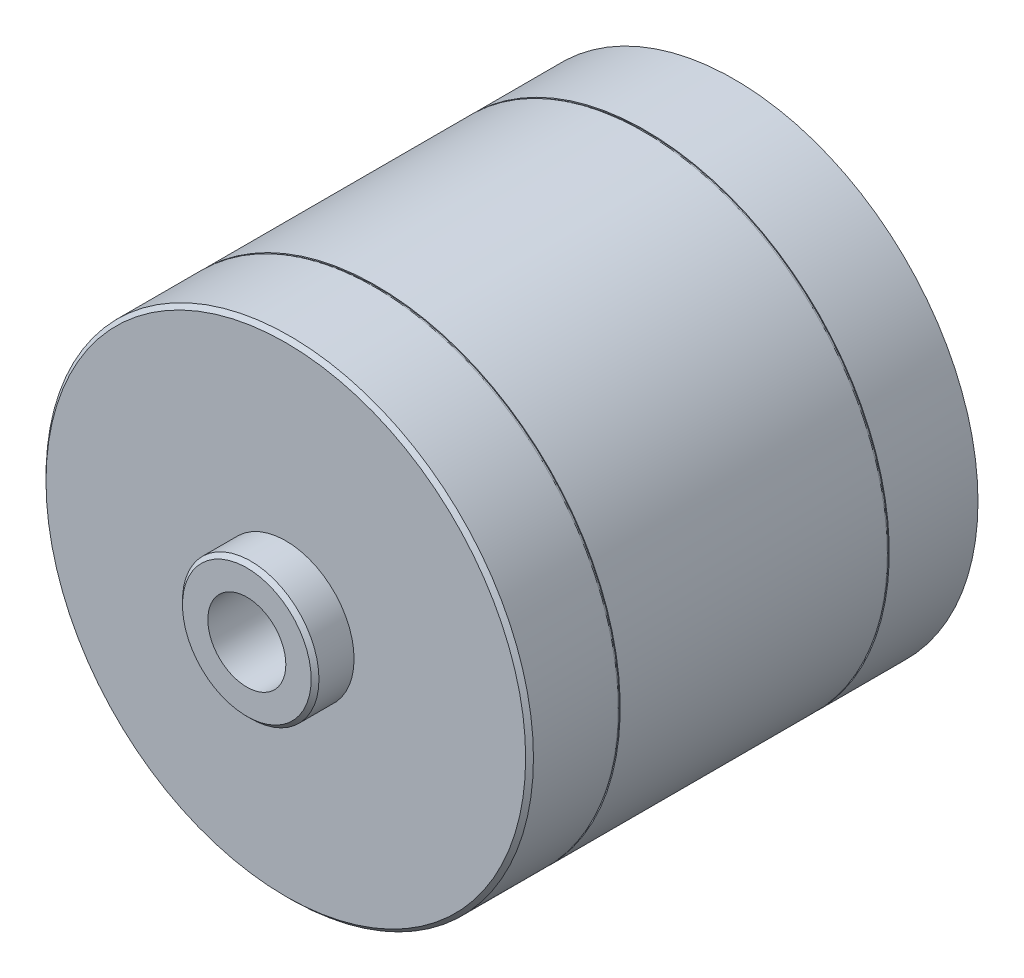
ISO-10303-21;
HEADER;
FILE_DESCRIPTION(('STEP AP214'),'2;1');
FILE_NAME('part.step','',(''),(''),'','','');
FILE_SCHEMA(('AUTOMOTIVE_DESIGN { 1 0 10303 214 1 1 1 1 }'));
ENDSEC;
DATA;
#1=APPLICATION_CONTEXT('core data for automotive mechanical design processes');
#2=APPLICATION_PROTOCOL_DEFINITION('international standard','automotive_design',2000,#1);
#3=PRODUCT_CONTEXT('',#1,'mechanical');
#4=PRODUCT('Part','Part','',(#3));
#5=PRODUCT_RELATED_PRODUCT_CATEGORY('part','',(#4));
#6=PRODUCT_DEFINITION_FORMATION('','',#4);
#7=PRODUCT_DEFINITION_CONTEXT('part definition',#1,'design');
#8=PRODUCT_DEFINITION('design','',#6,#7);
#9=PRODUCT_DEFINITION_SHAPE('','',#8);
#10=(LENGTH_UNIT() NAMED_UNIT(*) SI_UNIT(.MILLI.,.METRE.));
#11=(NAMED_UNIT(*) PLANE_ANGLE_UNIT() SI_UNIT($,.RADIAN.));
#12=(NAMED_UNIT(*) SI_UNIT($,.STERADIAN.) SOLID_ANGLE_UNIT());
#13=UNCERTAINTY_MEASURE_WITH_UNIT(LENGTH_MEASURE(1.E-05),#10,'distance_accuracy_value','');
#14=(GEOMETRIC_REPRESENTATION_CONTEXT(3) GLOBAL_UNCERTAINTY_ASSIGNED_CONTEXT((#13)) GLOBAL_UNIT_ASSIGNED_CONTEXT((#10,
#11,#12)) REPRESENTATION_CONTEXT('',''));
#15=CARTESIAN_POINT('',(0.,0.,0.));
#16=DIRECTION('',(0.,0.,1.));
#17=DIRECTION('',(1.,0.,0.));
#18=AXIS2_PLACEMENT_3D('',#15,#16,#17);
#19=CARTESIAN_POINT('',(0.,0.,23.));
#20=DIRECTION('',(0.,0.,-1.));
#21=DIRECTION('',(-1.,0.,0.));
#22=AXIS2_PLACEMENT_3D('',#19,#20,#21);
#23=CYLINDRICAL_SURFACE('',#22,12.5);
#24=CARTESIAN_POINT('',(0.,0.,18.45));
#25=DIRECTION('',(0.,0.,1.));
#26=DIRECTION('',(1.,0.,0.));
#27=AXIS2_PLACEMENT_3D('',#24,#25,#26);
#28=CIRCLE('',#27,12.5);
#29=CARTESIAN_POINT('',(12.5,0.,18.45));
#30=VERTEX_POINT('',#29);
#31=EDGE_CURVE('E81',#30,#30,#28,.T.);
#32=ORIENTED_EDGE('',*,*,#31,.T.);
#33=EDGE_LOOP('',(#32));
#34=FACE_BOUND('',#33,.T.);
#35=CARTESIAN_POINT('',(0.,0.,22.8));
#36=DIRECTION('',(0.,0.,1.));
#37=DIRECTION('',(1.,0.,0.));
#38=AXIS2_PLACEMENT_3D('',#35,#36,#37);
#39=CIRCLE('',#38,12.5);
#40=CARTESIAN_POINT('',(12.5,0.,22.8));
#41=VERTEX_POINT('',#40);
#42=EDGE_CURVE('E64',#41,#41,#39,.F.);
#43=ORIENTED_EDGE('',*,*,#42,.T.);
#44=EDGE_LOOP('',(#43));
#45=FACE_BOUND('',#44,.T.);
#46=ADVANCED_FACE('F50',(#34,#45),#23,.T.);
#47=CARTESIAN_POINT('',(0.,0.,23.));
#48=DIRECTION('',(0.,0.,1.));
#49=DIRECTION('',(1.,0.,0.));
#50=AXIS2_PLACEMENT_3D('',#47,#48,#49);
#51=PLANE('',#50);
#52=CARTESIAN_POINT('',(0.,0.,23.));
#53=DIRECTION('',(0.,0.,1.));
#54=DIRECTION('',(1.,0.,0.));
#55=AXIS2_PLACEMENT_3D('',#52,#53,#54);
#56=CIRCLE('',#55,12.3);
#57=CARTESIAN_POINT('',(12.3,0.,23.));
#58=VERTEX_POINT('',#57);
#59=EDGE_CURVE('E69',#58,#58,#56,.T.);
#60=ORIENTED_EDGE('',*,*,#59,.T.);
#61=EDGE_LOOP('',(#60));
#62=FACE_BOUND('',#61,.T.);
#63=CARTESIAN_POINT('',(0.,0.,23.));
#64=DIRECTION('',(0.,0.,1.));
#65=DIRECTION('',(1.,0.,0.));
#66=AXIS2_PLACEMENT_3D('',#63,#64,#65);
#67=CIRCLE('',#66,3.5);
#68=CARTESIAN_POINT('',(3.5,0.,23.));
#69=VERTEX_POINT('',#68);
#70=EDGE_CURVE('E93',#69,#69,#67,.T.);
#71=ORIENTED_EDGE('',*,*,#70,.F.);
#72=EDGE_LOOP('',(#71));
#73=FACE_BOUND('',#72,.T.);
#74=ADVANCED_FACE('F163',(#62,#73),#51,.T.);
#75=CARTESIAN_POINT('',(0.,0.,25.));
#76=DIRECTION('',(0.,0.,-1.));
#77=DIRECTION('',(-1.,0.,0.));
#78=AXIS2_PLACEMENT_3D('',#75,#76,#77);
#79=CYLINDRICAL_SURFACE('',#78,3.5);
#80=CARTESIAN_POINT('',(0.,0.,24.8));
#81=DIRECTION('',(0.,0.,1.));
#82=DIRECTION('',(1.,0.,0.));
#83=AXIS2_PLACEMENT_3D('',#80,#81,#82);
#84=CIRCLE('',#83,3.5);
#85=CARTESIAN_POINT('',(3.5,0.,24.8));
#86=VERTEX_POINT('',#85);
#87=EDGE_CURVE('E10',#86,#86,#84,.F.);
#88=ORIENTED_EDGE('',*,*,#87,.T.);
#89=EDGE_LOOP('',(#88));
#90=FACE_BOUND('',#89,.T.);
#91=ORIENTED_EDGE('',*,*,#70,.T.);
#92=EDGE_LOOP('',(#91));
#93=FACE_BOUND('',#92,.T.);
#94=ADVANCED_FACE('F169',(#90,#93),#79,.T.);
#95=CARTESIAN_POINT('',(0.,0.,25.));
#96=DIRECTION('',(0.,0.,1.));
#97=DIRECTION('',(1.,0.,0.));
#98=AXIS2_PLACEMENT_3D('',#95,#96,#97);
#99=PLANE('',#98);
#100=CARTESIAN_POINT('',(0.,0.,25.));
#101=DIRECTION('',(0.,0.,1.));
#102=DIRECTION('',(1.,0.,0.));
#103=AXIS2_PLACEMENT_3D('',#100,#101,#102);
#104=CIRCLE('',#103,3.29999999999999);
#105=CARTESIAN_POINT('',(3.29999999999999,0.,25.));
#106=VERTEX_POINT('',#105);
#107=EDGE_CURVE('E59',#106,#106,#104,.T.);
#108=ORIENTED_EDGE('',*,*,#107,.T.);
#109=EDGE_LOOP('',(#108));
#110=FACE_BOUND('',#109,.T.);
#111=CARTESIAN_POINT('',(0.,0.,25.));
#112=DIRECTION('',(0.,0.,1.));
#113=DIRECTION('',(1.,0.,0.));
#114=AXIS2_PLACEMENT_3D('',#111,#112,#113);
#115=CIRCLE('',#114,2.);
#116=CARTESIAN_POINT('',(2.,0.,25.));
#117=VERTEX_POINT('',#116);
#118=EDGE_CURVE('E76',#117,#117,#115,.T.);
#119=ORIENTED_EDGE('',*,*,#118,.F.);
#120=EDGE_LOOP('',(#119));
#121=FACE_BOUND('',#120,.T.);
#122=ADVANCED_FACE('F215',(#110,#121),#99,.T.);
#123=CARTESIAN_POINT('',(0.,0.,19.));
#124=DIRECTION('',(0.,0.,1.));
#125=DIRECTION('',(1.,0.,0.));
#126=AXIS2_PLACEMENT_3D('',#123,#124,#125);
#127=CYLINDRICAL_SURFACE('',#126,2.);
#128=CARTESIAN_POINT('',(0.,0.,19.));
#129=DIRECTION('',(0.,0.,1.));
#130=DIRECTION('',(1.,0.,0.));
#131=AXIS2_PLACEMENT_3D('',#128,#129,#130);
#132=CIRCLE('',#131,2.);
#133=CARTESIAN_POINT('',(2.,0.,19.));
#134=VERTEX_POINT('',#133);
#135=EDGE_CURVE('E98',#134,#134,#132,.T.);
#136=ORIENTED_EDGE('',*,*,#135,.F.);
#137=EDGE_LOOP('',(#136));
#138=FACE_BOUND('',#137,.T.);
#139=ORIENTED_EDGE('',*,*,#118,.T.);
#140=EDGE_LOOP('',(#139));
#141=FACE_BOUND('',#140,.T.);
#142=ADVANCED_FACE('F218',(#138,#141),#127,.F.);
#143=CARTESIAN_POINT('',(0.,0.,19.));
#144=DIRECTION('',(0.,0.,1.));
#145=DIRECTION('',(1.,0.,0.));
#146=AXIS2_PLACEMENT_3D('',#143,#144,#145);
#147=PLANE('',#146);
#148=ORIENTED_EDGE('',*,*,#135,.T.);
#149=EDGE_LOOP('',(#148));
#150=FACE_BOUND('',#149,.T.);
#151=ADVANCED_FACE('F260',(#150),#147,.T.);
#152=CARTESIAN_POINT('',(0.,0.,23.));
#153=DIRECTION('',(0.,0.,-1.));
#154=DIRECTION('',(-1.,0.,0.));
#155=AXIS2_PLACEMENT_3D('',#152,#153,#154);
#156=CONICAL_SURFACE('',#155,12.3,0.785398163397431);
#157=ORIENTED_EDGE('',*,*,#42,.F.);
#158=EDGE_LOOP('',(#157));
#159=FACE_BOUND('',#158,.T.);
#160=ORIENTED_EDGE('',*,*,#59,.F.);
#161=EDGE_LOOP('',(#160));
#162=FACE_BOUND('',#161,.T.);
#163=ADVANCED_FACE('F159',(#159,#162),#156,.T.);
#164=CARTESIAN_POINT('',(-12.55,0.,18.45));
#165=DIRECTION('',(0.,0.,1.));
#166=DIRECTION('',(1.,0.,0.));
#167=AXIS2_PLACEMENT_3D('',#164,#165,#166);
#168=PLANE('',#167);
#169=CARTESIAN_POINT('',(0.,0.,18.45));
#170=DIRECTION('',(0.,0.,-1.));
#171=DIRECTION('',(-1.,0.,0.));
#172=AXIS2_PLACEMENT_3D('',#169,#170,#171);
#173=CIRCLE('',#172,12.45);
#174=CARTESIAN_POINT('',(-12.45,0.,18.45));
#175=VERTEX_POINT('',#174);
#176=EDGE_CURVE('E108',#175,#175,#173,.T.);
#177=ORIENTED_EDGE('',*,*,#176,.F.);
#178=EDGE_LOOP('',(#177));
#179=FACE_BOUND('',#178,.T.);
#180=ORIENTED_EDGE('',*,*,#31,.F.);
#181=EDGE_LOOP('',(#180));
#182=FACE_BOUND('',#181,.T.);
#183=ADVANCED_FACE('F150',(#179,#182),#168,.F.);
#184=CARTESIAN_POINT('',(-12.55,0.,18.35));
#185=DIRECTION('',(0.,0.,-1.));
#186=DIRECTION('',(-1.,0.,0.));
#187=AXIS2_PLACEMENT_3D('',#184,#185,#186);
#188=PLANE('',#187);
#189=CARTESIAN_POINT('',(0.,0.,18.35));
#190=DIRECTION('',(0.,0.,-1.));
#191=DIRECTION('',(-1.,0.,0.));
#192=AXIS2_PLACEMENT_3D('',#189,#190,#191);
#193=CIRCLE('',#192,12.45);
#194=CARTESIAN_POINT('',(-12.45,0.,18.35));
#195=VERTEX_POINT('',#194);
#196=EDGE_CURVE('E113',#195,#195,#193,.T.);
#197=ORIENTED_EDGE('',*,*,#196,.T.);
#198=EDGE_LOOP('',(#197));
#199=FACE_BOUND('',#198,.T.);
#200=CARTESIAN_POINT('',(0.,0.,18.35));
#201=DIRECTION('',(0.,0.,-1.));
#202=DIRECTION('',(-1.,0.,0.));
#203=AXIS2_PLACEMENT_3D('',#200,#201,#202);
#204=CIRCLE('',#203,12.5);
#205=CARTESIAN_POINT('',(-12.5,0.,18.35));
#206=VERTEX_POINT('',#205);
#207=EDGE_CURVE('E85',#206,#206,#204,.T.);
#208=ORIENTED_EDGE('',*,*,#207,.F.);
#209=EDGE_LOOP('',(#208));
#210=FACE_BOUND('',#209,.T.);
#211=ADVANCED_FACE('F148',(#199,#210),#188,.F.);
#212=CARTESIAN_POINT('',(0.,0.,0.));
#213=DIRECTION('',(0.,0.,-1.));
#214=DIRECTION('',(-1.,0.,0.));
#215=AXIS2_PLACEMENT_3D('',#212,#213,#214);
#216=CYLINDRICAL_SURFACE('',#215,12.45);
#217=ORIENTED_EDGE('',*,*,#196,.F.);
#218=EDGE_LOOP('',(#217));
#219=FACE_BOUND('',#218,.T.);
#220=ORIENTED_EDGE('',*,*,#176,.T.);
#221=EDGE_LOOP('',(#220));
#222=FACE_BOUND('',#221,.T.);
#223=ADVANCED_FACE('F143',(#219,#222),#216,.T.);
#224=CARTESIAN_POINT('',(0.,0.,4.65));
#225=DIRECTION('',(0.,0.,1.));
#226=DIRECTION('',(1.,0.,0.));
#227=AXIS2_PLACEMENT_3D('',#224,#225,#226);
#228=CIRCLE('',#227,12.5);
#229=CARTESIAN_POINT('',(12.5,0.,4.65));
#230=VERTEX_POINT('',#229);
#231=EDGE_CURVE('E72',#230,#230,#228,.T.);
#232=ORIENTED_EDGE('',*,*,#231,.T.);
#233=EDGE_LOOP('',(#232));
#234=FACE_BOUND('',#233,.T.);
#235=ORIENTED_EDGE('',*,*,#207,.T.);
#236=EDGE_LOOP('',(#235));
#237=FACE_BOUND('',#236,.T.);
#238=ADVANCED_FACE('F137',(#234,#237),#23,.T.);
#239=CARTESIAN_POINT('',(-12.55,0.,4.65));
#240=DIRECTION('',(0.,0.,1.));
#241=DIRECTION('',(1.,0.,0.));
#242=AXIS2_PLACEMENT_3D('',#239,#240,#241);
#243=PLANE('',#242);
#244=CARTESIAN_POINT('',(0.,0.,4.65));
#245=DIRECTION('',(0.,0.,-1.));
#246=DIRECTION('',(-1.,0.,0.));
#247=AXIS2_PLACEMENT_3D('',#244,#245,#246);
#248=CIRCLE('',#247,12.45);
#249=CARTESIAN_POINT('',(-12.45,0.,4.65));
#250=VERTEX_POINT('',#249);
#251=EDGE_CURVE('E88',#250,#250,#248,.T.);
#252=ORIENTED_EDGE('',*,*,#251,.F.);
#253=EDGE_LOOP('',(#252));
#254=FACE_BOUND('',#253,.T.);
#255=ORIENTED_EDGE('',*,*,#231,.F.);
#256=EDGE_LOOP('',(#255));
#257=FACE_BOUND('',#256,.T.);
#258=ADVANCED_FACE('F134',(#254,#257),#243,.F.);
#259=CARTESIAN_POINT('',(-12.55,0.,4.55));
#260=DIRECTION('',(0.,0.,-1.));
#261=DIRECTION('',(-1.,0.,0.));
#262=AXIS2_PLACEMENT_3D('',#259,#260,#261);
#263=PLANE('',#262);
#264=CARTESIAN_POINT('',(0.,0.,4.55));
#265=DIRECTION('',(0.,0.,-1.));
#266=DIRECTION('',(-1.,0.,0.));
#267=AXIS2_PLACEMENT_3D('',#264,#265,#266);
#268=CIRCLE('',#267,12.45);
#269=CARTESIAN_POINT('',(-12.45,0.,4.55));
#270=VERTEX_POINT('',#269);
#271=EDGE_CURVE('E112',#270,#270,#268,.T.);
#272=ORIENTED_EDGE('',*,*,#271,.T.);
#273=EDGE_LOOP('',(#272));
#274=FACE_BOUND('',#273,.T.);
#275=CARTESIAN_POINT('',(0.,0.,4.55));
#276=DIRECTION('',(0.,0.,-1.));
#277=DIRECTION('',(-1.,0.,0.));
#278=AXIS2_PLACEMENT_3D('',#275,#276,#277);
#279=CIRCLE('',#278,12.5);
#280=CARTESIAN_POINT('',(-12.5,0.,4.55));
#281=VERTEX_POINT('',#280);
#282=EDGE_CURVE('E77',#281,#281,#279,.T.);
#283=ORIENTED_EDGE('',*,*,#282,.F.);
#284=EDGE_LOOP('',(#283));
#285=FACE_BOUND('',#284,.T.);
#286=ADVANCED_FACE('F124',(#274,#285),#263,.F.);
#287=CARTESIAN_POINT('',(0.,0.,0.));
#288=DIRECTION('',(0.,0.,-1.));
#289=DIRECTION('',(-1.,0.,0.));
#290=AXIS2_PLACEMENT_3D('',#287,#288,#289);
#291=CYLINDRICAL_SURFACE('',#290,12.45);
#292=ORIENTED_EDGE('',*,*,#271,.F.);
#293=EDGE_LOOP('',(#292));
#294=FACE_BOUND('',#293,.T.);
#295=ORIENTED_EDGE('',*,*,#251,.T.);
#296=EDGE_LOOP('',(#295));
#297=FACE_BOUND('',#296,.T.);
#298=ADVANCED_FACE('F127',(#294,#297),#291,.T.);
#299=CARTESIAN_POINT('',(0.,0.,0.));
#300=DIRECTION('',(0.,0.,1.));
#301=DIRECTION('',(1.,0.,0.));
#302=AXIS2_PLACEMENT_3D('',#299,#300,#301);
#303=PLANE('',#302);
#304=CARTESIAN_POINT('',(0.,0.,0.));
#305=DIRECTION('',(0.,0.,1.));
#306=DIRECTION('',(1.,0.,0.));
#307=AXIS2_PLACEMENT_3D('',#304,#305,#306);
#308=CIRCLE('',#307,12.5);
#309=CARTESIAN_POINT('',(12.5,0.,0.));
#310=VERTEX_POINT('',#309);
#311=EDGE_CURVE('E94',#310,#310,#308,.T.);
#312=ORIENTED_EDGE('',*,*,#311,.F.);
#313=EDGE_LOOP('',(#312));
#314=FACE_BOUND('',#313,.T.);
#315=ADVANCED_FACE('F130',(#314),#303,.F.);
#316=ORIENTED_EDGE('',*,*,#282,.T.);
#317=EDGE_LOOP('',(#316));
#318=FACE_BOUND('',#317,.T.);
#319=ORIENTED_EDGE('',*,*,#311,.T.);
#320=EDGE_LOOP('',(#319));
#321=FACE_BOUND('',#320,.T.);
#322=ADVANCED_FACE('F145',(#318,#321),#23,.T.);
#323=CARTESIAN_POINT('',(0.,0.,25.));
#324=DIRECTION('',(0.,0.,-1.));
#325=DIRECTION('',(-1.,0.,0.));
#326=AXIS2_PLACEMENT_3D('',#323,#324,#325);
#327=CONICAL_SURFACE('',#326,3.29999999999999,0.785398163397441);
#328=ORIENTED_EDGE('',*,*,#87,.F.);
#329=EDGE_LOOP('',(#328));
#330=FACE_BOUND('',#329,.T.);
#331=ORIENTED_EDGE('',*,*,#107,.F.);
#332=EDGE_LOOP('',(#331));
#333=FACE_BOUND('',#332,.T.);
#334=ADVANCED_FACE('F53',(#330,#333),#327,.T.);
#335=CLOSED_SHELL('',(#46,#74,#94,#122,#142,#151,#163,#183,#211,#223,#238,#258,#286,#298,#315,
#322,#334));
#336=MANIFOLD_SOLID_BREP('B2',#335);
#337=ADVANCED_BREP_SHAPE_REPRESENTATION('',(#18,#336),#14);
#338=SHAPE_DEFINITION_REPRESENTATION(#9,#337);
ENDSEC;
END-ISO-10303-21;
